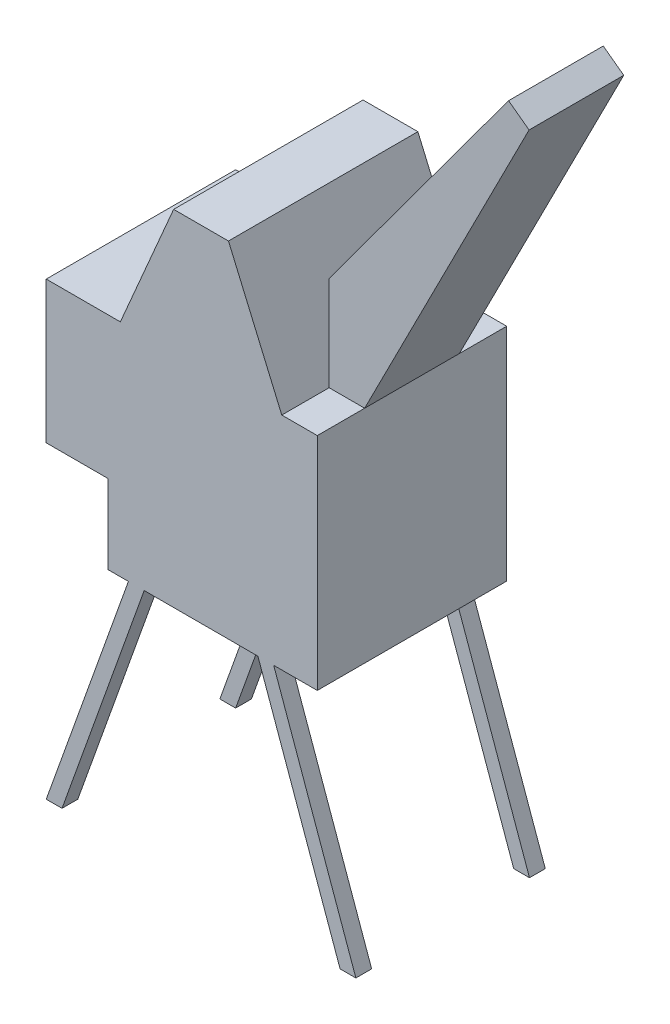
ISO-10303-21;
HEADER;
FILE_DESCRIPTION(('STEP AP214'),'2;1');
FILE_NAME('part.step','',(''),(''),'','','');
FILE_SCHEMA(('AUTOMOTIVE_DESIGN { 1 0 10303 214 1 1 1 1 }'));
ENDSEC;
DATA;
#1=APPLICATION_CONTEXT('core data for automotive mechanical design processes');
#2=APPLICATION_PROTOCOL_DEFINITION('international standard','automotive_design',2000,#1);
#3=PRODUCT_CONTEXT('',#1,'mechanical');
#4=PRODUCT('Part','Part','',(#3));
#5=PRODUCT_RELATED_PRODUCT_CATEGORY('part','',(#4));
#6=PRODUCT_DEFINITION_FORMATION('','',#4);
#7=PRODUCT_DEFINITION_CONTEXT('part definition',#1,'design');
#8=PRODUCT_DEFINITION('design','',#6,#7);
#9=PRODUCT_DEFINITION_SHAPE('','',#8);
#10=(LENGTH_UNIT() NAMED_UNIT(*) SI_UNIT(.MILLI.,.METRE.));
#11=(NAMED_UNIT(*) PLANE_ANGLE_UNIT() SI_UNIT($,.RADIAN.));
#12=(NAMED_UNIT(*) SI_UNIT($,.STERADIAN.) SOLID_ANGLE_UNIT());
#13=UNCERTAINTY_MEASURE_WITH_UNIT(LENGTH_MEASURE(1.E-05),#10,'distance_accuracy_value','');
#14=(GEOMETRIC_REPRESENTATION_CONTEXT(3) GLOBAL_UNCERTAINTY_ASSIGNED_CONTEXT((#13)) GLOBAL_UNIT_ASSIGNED_CONTEXT((#10,
#11,#12)) REPRESENTATION_CONTEXT('',''));
#15=CARTESIAN_POINT('',(0.,0.,0.));
#16=DIRECTION('',(0.,0.,1.));
#17=DIRECTION('',(1.,0.,0.));
#18=AXIS2_PLACEMENT_3D('',#15,#16,#17);
#19=CARTESIAN_POINT('',(397.181123675562,1478.72440717202,609.6));
#20=DIRECTION('',(0.,1.,0.));
#21=DIRECTION('',(0.,0.,1.));
#22=AXIS2_PLACEMENT_3D('',#19,#20,#21);
#23=PLANE('',#22);
#24=DIRECTION('',(0.,0.,-1.));
#25=VECTOR('',#24,1.);
#26=CARTESIAN_POINT('',(1464.20410179023,1478.72440717202,-508.));
#27=LINE('',#26,#25);
#28=CARTESIAN_POINT('',(1464.20410179023,1478.72440717202,-508.));
#29=VERTEX_POINT('',#28);
#30=CARTESIAN_POINT('',(1464.20410179023,1478.72440717202,-609.6));
#31=VERTEX_POINT('',#30);
#32=EDGE_CURVE('E260',#29,#31,#27,.T.);
#33=ORIENTED_EDGE('',*,*,#32,.T.);
#34=DIRECTION('',(1.,0.,0.));
#35=VECTOR('',#34,1.);
#36=CARTESIAN_POINT('',(397.181123675562,1478.72440717202,-609.6));
#37=LINE('',#36,#35);
#38=CARTESIAN_POINT('',(1744.83154288961,1478.72440717202,-609.6));
#39=VERTEX_POINT('',#38);
#40=EDGE_CURVE('E413',#31,#39,#37,.T.);
#41=ORIENTED_EDGE('',*,*,#40,.T.);
#42=DIRECTION('',(0.,0.,-1.));
#43=VECTOR('',#42,1.);
#44=CARTESIAN_POINT('',(1744.83154288961,1478.72440717202,609.6));
#45=LINE('',#44,#43);
#46=CARTESIAN_POINT('',(1744.83154288961,1478.72440717202,609.6));
#47=VERTEX_POINT('',#46);
#48=EDGE_CURVE('E43',#47,#39,#45,.T.);
#49=ORIENTED_EDGE('',*,*,#48,.F.);
#50=DIRECTION('',(1.,0.,0.));
#51=VECTOR('',#50,1.);
#52=CARTESIAN_POINT('',(397.181123675562,1478.72440717202,609.6));
#53=LINE('',#52,#51);
#54=CARTESIAN_POINT('',(1464.20410179023,1478.72440717202,609.6));
#55=VERTEX_POINT('',#54);
#56=EDGE_CURVE('E37',#55,#47,#53,.T.);
#57=ORIENTED_EDGE('',*,*,#56,.F.);
#58=DIRECTION('',(0.,0.,1.));
#59=VECTOR('',#58,1.);
#60=CARTESIAN_POINT('',(1464.20410179023,1478.72440717202,508.));
#61=LINE('',#60,#59);
#62=CARTESIAN_POINT('',(1464.20410179023,1478.72440717202,508.));
#63=VERTEX_POINT('',#62);
#64=EDGE_CURVE('E316',#63,#55,#61,.T.);
#65=ORIENTED_EDGE('',*,*,#64,.F.);
#66=DIRECTION('',(-1.,0.,0.));
#67=VECTOR('',#66,1.);
#68=CARTESIAN_POINT('',(1464.20410179023,1478.72440717202,508.));
#69=LINE('',#68,#67);
#70=CARTESIAN_POINT('',(1362.60410179023,1478.72440717202,508.));
#71=VERTEX_POINT('',#70);
#72=EDGE_CURVE('E306',#63,#71,#69,.T.);
#73=ORIENTED_EDGE('',*,*,#72,.T.);
#74=DIRECTION('',(0.,0.,1.));
#75=VECTOR('',#74,1.);
#76=CARTESIAN_POINT('',(1362.60410179023,1478.72440717202,508.));
#77=LINE('',#76,#75);
#78=CARTESIAN_POINT('',(1362.60410179023,1478.72440717202,609.6));
#79=VERTEX_POINT('',#78);
#80=EDGE_CURVE('E328',#71,#79,#77,.T.);
#81=ORIENTED_EDGE('',*,*,#80,.T.);
#82=CARTESIAN_POINT('',(630.610881251015,1478.72440717202,609.6));
#83=VERTEX_POINT('',#82);
#84=EDGE_CURVE('E377',#83,#79,#53,.T.);
#85=ORIENTED_EDGE('',*,*,#84,.F.);
#86=DIRECTION('',(0.,0.,1.));
#87=VECTOR('',#86,1.);
#88=CARTESIAN_POINT('',(630.610881251015,1478.72440717202,508.));
#89=LINE('',#88,#87);
#90=CARTESIAN_POINT('',(630.610881251015,1478.72440717202,508.));
#91=VERTEX_POINT('',#90);
#92=EDGE_CURVE('E352',#91,#83,#89,.T.);
#93=ORIENTED_EDGE('',*,*,#92,.F.);
#94=DIRECTION('',(-1.,0.,0.));
#95=VECTOR('',#94,1.);
#96=CARTESIAN_POINT('',(630.610881251015,1478.72440717202,508.));
#97=LINE('',#96,#95);
#98=CARTESIAN_POINT('',(529.010881251015,1478.72440717202,508.));
#99=VERTEX_POINT('',#98);
#100=EDGE_CURVE('E333',#91,#99,#97,.T.);
#101=ORIENTED_EDGE('',*,*,#100,.T.);
#102=DIRECTION('',(0.,0.,1.));
#103=VECTOR('',#102,1.);
#104=CARTESIAN_POINT('',(529.010881251015,1478.72440717202,508.));
#105=LINE('',#104,#103);
#106=CARTESIAN_POINT('',(529.010881251015,1478.72440717202,609.6));
#107=VERTEX_POINT('',#106);
#108=EDGE_CURVE('E346',#99,#107,#105,.T.);
#109=ORIENTED_EDGE('',*,*,#108,.T.);
#110=CARTESIAN_POINT('',(397.181123675562,1478.72440717202,609.6));
#111=VERTEX_POINT('',#110);
#112=EDGE_CURVE('E382',#111,#107,#53,.T.);
#113=ORIENTED_EDGE('',*,*,#112,.F.);
#114=DIRECTION('',(0.,0.,-1.));
#115=VECTOR('',#114,1.);
#116=CARTESIAN_POINT('',(397.181123675562,1478.72440717202,609.6));
#117=LINE('',#116,#115);
#118=CARTESIAN_POINT('',(397.181123675562,1478.72440717202,-609.6));
#119=VERTEX_POINT('',#118);
#120=EDGE_CURVE('E11',#111,#119,#117,.T.);
#121=ORIENTED_EDGE('',*,*,#120,.T.);
#122=CARTESIAN_POINT('',(529.010881251015,1478.72440717202,-609.6));
#123=VERTEX_POINT('',#122);
#124=EDGE_CURVE('E415',#119,#123,#37,.T.);
#125=ORIENTED_EDGE('',*,*,#124,.T.);
#126=DIRECTION('',(0.,0.,-1.));
#127=VECTOR('',#126,1.);
#128=CARTESIAN_POINT('',(529.010881251015,1478.72440717202,-508.));
#129=LINE('',#128,#127);
#130=CARTESIAN_POINT('',(529.010881251015,1478.72440717202,-508.));
#131=VERTEX_POINT('',#130);
#132=EDGE_CURVE('E291',#131,#123,#129,.T.);
#133=ORIENTED_EDGE('',*,*,#132,.F.);
#134=DIRECTION('',(-1.,0.,0.));
#135=VECTOR('',#134,1.);
#136=CARTESIAN_POINT('',(630.610881251015,1478.72440717202,-508.));
#137=LINE('',#136,#135);
#138=CARTESIAN_POINT('',(630.610881251015,1478.72440717202,-508.));
#139=VERTEX_POINT('',#138);
#140=EDGE_CURVE('E274',#139,#131,#137,.T.);
#141=ORIENTED_EDGE('',*,*,#140,.F.);
#142=DIRECTION('',(0.,0.,-1.));
#143=VECTOR('',#142,1.);
#144=CARTESIAN_POINT('',(630.610881251015,1478.72440717202,-508.));
#145=LINE('',#144,#143);
#146=CARTESIAN_POINT('',(630.610881251015,1478.72440717202,-609.6));
#147=VERTEX_POINT('',#146);
#148=EDGE_CURVE('E285',#139,#147,#145,.T.);
#149=ORIENTED_EDGE('',*,*,#148,.T.);
#150=CARTESIAN_POINT('',(1362.60410179023,1478.72440717202,-609.6));
#151=VERTEX_POINT('',#150);
#152=EDGE_CURVE('E418',#147,#151,#37,.T.);
#153=ORIENTED_EDGE('',*,*,#152,.T.);
#154=DIRECTION('',(0.,0.,-1.));
#155=VECTOR('',#154,1.);
#156=CARTESIAN_POINT('',(1362.60410179023,1478.72440717202,-508.));
#157=LINE('',#156,#155);
#158=CARTESIAN_POINT('',(1362.60410179023,1478.72440717202,-508.));
#159=VERTEX_POINT('',#158);
#160=EDGE_CURVE('E51',#159,#151,#157,.T.);
#161=ORIENTED_EDGE('',*,*,#160,.F.);
#162=DIRECTION('',(-1.,0.,0.));
#163=VECTOR('',#162,1.);
#164=CARTESIAN_POINT('',(1464.20410179023,1478.72440717202,-508.));
#165=LINE('',#164,#163);
#166=EDGE_CURVE('E55',#29,#159,#165,.T.);
#167=ORIENTED_EDGE('',*,*,#166,.F.);
#168=EDGE_LOOP('',(#33,#41,#49,#57,#65,#73,#81,#85,#93,#101,#109,#113,#121,#125,#133,#141,#149,
#153,#161,#167));
#169=FACE_BOUND('',#168,.T.);
#170=ADVANCED_FACE('F33',(#169),#23,.F.);
#171=CARTESIAN_POINT('',(1516.23154288961,2899.73266424527,609.6));
#172=DIRECTION('',(0.,-1.,0.));
#173=DIRECTION('',(0.,0.,-1.));
#174=AXIS2_PLACEMENT_3D('',#171,#172,#173);
#175=PLANE('',#174);
#176=DIRECTION('',(1.,0.,0.));
#177=VECTOR('',#176,1.);
#178=CARTESIAN_POINT('',(1516.23154288961,2899.73266424527,304.8));
#179=LINE('',#178,#177);
#180=CARTESIAN_POINT('',(1516.23154288961,2899.73266424527,304.8));
#181=VERTEX_POINT('',#180);
#182=CARTESIAN_POINT('',(1744.83154288961,2899.73266424527,304.8));
#183=VERTEX_POINT('',#182);
#184=EDGE_CURVE('E495',#181,#183,#179,.T.);
#185=ORIENTED_EDGE('',*,*,#184,.F.);
#186=DIRECTION('',(0.,0.,-1.));
#187=VECTOR('',#186,1.);
#188=CARTESIAN_POINT('',(1516.23154288961,2899.73266424527,609.6));
#189=LINE('',#188,#187);
#190=CARTESIAN_POINT('',(1516.23154288961,2899.73266424527,609.6));
#191=VERTEX_POINT('',#190);
#192=EDGE_CURVE('E454',#191,#181,#189,.T.);
#193=ORIENTED_EDGE('',*,*,#192,.F.);
#194=DIRECTION('',(-1.,0.,0.));
#195=VECTOR('',#194,1.);
#196=CARTESIAN_POINT('',(1516.23154288961,2899.73266424527,609.6));
#197=LINE('',#196,#195);
#198=CARTESIAN_POINT('',(1744.83154288961,2899.73266424527,609.6));
#199=VERTEX_POINT('',#198);
#200=EDGE_CURVE('E395',#199,#191,#197,.T.);
#201=ORIENTED_EDGE('',*,*,#200,.F.);
#202=DIRECTION('',(0.,0.,-1.));
#203=VECTOR('',#202,1.);
#204=CARTESIAN_POINT('',(1744.83154288961,2899.73266424527,609.6));
#205=LINE('',#204,#203);
#206=EDGE_CURVE('E458',#199,#183,#205,.T.);
#207=ORIENTED_EDGE('',*,*,#206,.T.);
#208=EDGE_LOOP('',(#185,#193,#201,#207));
#209=FACE_BOUND('',#208,.T.);
#210=ADVANCED_FACE('F493',(#209),#175,.F.);
#211=CARTESIAN_POINT('',(397.181123675562,1986.75694769304,609.6));
#212=DIRECTION('',(1.,0.,0.));
#213=DIRECTION('',(0.,0.,-1.));
#214=AXIS2_PLACEMENT_3D('',#211,#212,#213);
#215=PLANE('',#214);
#216=DIRECTION('',(0.,-1.,0.));
#217=VECTOR('',#216,1.);
#218=CARTESIAN_POINT('',(397.181123675562,1986.75694769304,-609.6));
#219=LINE('',#218,#217);
#220=CARTESIAN_POINT('',(397.181123675562,1986.75694769304,-609.6));
#221=VERTEX_POINT('',#220);
#222=EDGE_CURVE('E410',#221,#119,#219,.T.);
#223=ORIENTED_EDGE('',*,*,#222,.T.);
#224=ORIENTED_EDGE('',*,*,#120,.F.);
#225=DIRECTION('',(0.,-1.,0.));
#226=VECTOR('',#225,1.);
#227=CARTESIAN_POINT('',(397.181123675562,1986.75694769304,609.6));
#228=LINE('',#227,#226);
#229=CARTESIAN_POINT('',(397.181123675562,1986.75694769304,609.6));
#230=VERTEX_POINT('',#229);
#231=EDGE_CURVE('E387',#230,#111,#228,.T.);
#232=ORIENTED_EDGE('',*,*,#231,.F.);
#233=DIRECTION('',(0.,0.,-1.));
#234=VECTOR('',#233,1.);
#235=CARTESIAN_POINT('',(397.181123675562,1986.75694769304,609.6));
#236=LINE('',#235,#234);
#237=EDGE_CURVE('E409',#230,#221,#236,.T.);
#238=ORIENTED_EDGE('',*,*,#237,.T.);
#239=EDGE_LOOP('',(#223,#224,#232,#238));
#240=FACE_BOUND('',#239,.T.);
#241=ADVANCED_FACE('F35',(#240),#215,.F.);
#242=CARTESIAN_POINT('',(1744.83154288961,2899.73266424527,609.6));
#243=DIRECTION('',(-1.,0.,0.));
#244=DIRECTION('',(0.,-1.,0.));
#245=AXIS2_PLACEMENT_3D('',#242,#243,#244);
#246=PLANE('',#245);
#247=DIRECTION('',(0.,1.,0.));
#248=VECTOR('',#247,1.);
#249=CARTESIAN_POINT('',(1744.83154288961,2899.73266424527,-609.6));
#250=LINE('',#249,#248);
#251=CARTESIAN_POINT('',(1744.83154288961,2899.73266424527,-609.6));
#252=VERTEX_POINT('',#251);
#253=EDGE_CURVE('E417',#39,#252,#250,.T.);
#254=ORIENTED_EDGE('',*,*,#253,.T.);
#255=CARTESIAN_POINT('',(1744.83154288961,2899.73266424527,-304.8));
#256=VERTEX_POINT('',#255);
#257=EDGE_CURVE('E457',#256,#252,#205,.T.);
#258=ORIENTED_EDGE('',*,*,#257,.F.);
#259=DIRECTION('',(0.,0.,-1.));
#260=VECTOR('',#259,1.);
#261=CARTESIAN_POINT('',(1744.83154288961,2899.73266424527,304.8));
#262=LINE('',#261,#260);
#263=EDGE_CURVE('E483',#183,#256,#262,.T.);
#264=ORIENTED_EDGE('',*,*,#263,.F.);
#265=ORIENTED_EDGE('',*,*,#206,.F.);
#266=DIRECTION('',(0.,1.,0.));
#267=VECTOR('',#266,1.);
#268=CARTESIAN_POINT('',(1744.83154288961,2899.73266424527,609.6));
#269=LINE('',#268,#267);
#270=EDGE_CURVE('E385',#47,#199,#269,.T.);
#271=ORIENTED_EDGE('',*,*,#270,.F.);
#272=ORIENTED_EDGE('',*,*,#48,.T.);
#273=EDGE_LOOP('',(#254,#258,#264,#265,#271,#272));
#274=FACE_BOUND('',#273,.T.);
#275=ADVANCED_FACE('F466',(#274),#246,.F.);
#276=CARTESIAN_POINT('',(1516.23154288961,2899.73266424527,-304.8));
#277=VERTEX_POINT('',#276);
#278=CARTESIAN_POINT('',(1516.23154288961,2899.73266424527,-609.6));
#279=VERTEX_POINT('',#278);
#280=EDGE_CURVE('E453',#277,#279,#189,.T.);
#281=ORIENTED_EDGE('',*,*,#280,.F.);
#282=DIRECTION('',(1.,0.,0.));
#283=VECTOR('',#282,1.);
#284=CARTESIAN_POINT('',(1516.23154288961,2899.73266424527,-304.8));
#285=LINE('',#284,#283);
#286=EDGE_CURVE('E481',#277,#256,#285,.T.);
#287=ORIENTED_EDGE('',*,*,#286,.T.);
#288=ORIENTED_EDGE('',*,*,#257,.T.);
#289=DIRECTION('',(-1.,0.,0.));
#290=VECTOR('',#289,1.);
#291=CARTESIAN_POINT('',(1516.23154288961,2899.73266424527,-609.6));
#292=LINE('',#291,#290);
#293=EDGE_CURVE('E421',#252,#279,#292,.T.);
#294=ORIENTED_EDGE('',*,*,#293,.T.);
#295=EDGE_LOOP('',(#281,#287,#288,#294));
#296=FACE_BOUND('',#295,.T.);
#297=ADVANCED_FACE('F478',(#296),#175,.F.);
#298=CARTESIAN_POINT('',(1173.05310330733,3698.52009892287,609.6));
#299=DIRECTION('',(-0.918794433226703,-0.394736354383051,0.));
#300=DIRECTION('',(0.394736354383051,-0.918794433226703,0.));
#301=AXIS2_PLACEMENT_3D('',#298,#299,#300);
#302=PLANE('',#301);
#303=DIRECTION('',(-0.394736354383051,0.918794433226703,0.));
#304=VECTOR('',#303,1.);
#305=CARTESIAN_POINT('',(1173.05310330733,3698.52009892287,-609.6));
#306=LINE('',#305,#304);
#307=CARTESIAN_POINT('',(1173.05310330733,3698.52009892287,-609.6));
#308=VERTEX_POINT('',#307);
#309=EDGE_CURVE('E424',#279,#308,#306,.T.);
#310=ORIENTED_EDGE('',*,*,#309,.T.);
#311=DIRECTION('',(0.,0.,-1.));
#312=VECTOR('',#311,1.);
#313=CARTESIAN_POINT('',(1173.05310330733,3698.52009892287,609.6));
#314=LINE('',#313,#312);
#315=CARTESIAN_POINT('',(1173.05310330733,3698.52009892287,609.6));
#316=VERTEX_POINT('',#315);
#317=EDGE_CURVE('E450',#316,#308,#314,.T.);
#318=ORIENTED_EDGE('',*,*,#317,.F.);
#319=DIRECTION('',(-0.394736354383051,0.918794433226703,0.));
#320=VECTOR('',#319,1.);
#321=CARTESIAN_POINT('',(1173.05310330733,3698.52009892287,609.6));
#322=LINE('',#321,#320);
#323=EDGE_CURVE('E397',#191,#316,#322,.T.);
#324=ORIENTED_EDGE('',*,*,#323,.F.);
#325=ORIENTED_EDGE('',*,*,#192,.T.);
#326=DIRECTION('',(0.,0.,-1.));
#327=VECTOR('',#326,1.);
#328=CARTESIAN_POINT('',(1516.23154288961,2899.73266424527,304.8));
#329=LINE('',#328,#327);
#330=EDGE_CURVE('E488',#181,#277,#329,.T.);
#331=ORIENTED_EDGE('',*,*,#330,.T.);
#332=ORIENTED_EDGE('',*,*,#280,.T.);
#333=EDGE_LOOP('',(#310,#318,#324,#325,#331,#332));
#334=FACE_BOUND('',#333,.T.);
#335=ADVANCED_FACE('F531',(#334),#302,.F.);
#336=CARTESIAN_POINT('',(820.161879733915,3698.52009892287,609.6));
#337=DIRECTION('',(0.,-1.,0.));
#338=DIRECTION('',(0.,0.,-1.));
#339=AXIS2_PLACEMENT_3D('',#336,#337,#338);
#340=PLANE('',#339);
#341=DIRECTION('',(-1.,0.,0.));
#342=VECTOR('',#341,1.);
#343=CARTESIAN_POINT('',(820.161879733915,3698.52009892287,-609.6));
#344=LINE('',#343,#342);
#345=CARTESIAN_POINT('',(820.161879733915,3698.52009892287,-609.6));
#346=VERTEX_POINT('',#345);
#347=EDGE_CURVE('E426',#308,#346,#344,.T.);
#348=ORIENTED_EDGE('',*,*,#347,.T.);
#349=DIRECTION('',(0.,0.,-1.));
#350=VECTOR('',#349,1.);
#351=CARTESIAN_POINT('',(820.161879733915,3698.52009892287,609.6));
#352=LINE('',#351,#350);
#353=CARTESIAN_POINT('',(820.161879733915,3698.52009892287,609.6));
#354=VERTEX_POINT('',#353);
#355=EDGE_CURVE('E447',#354,#346,#352,.T.);
#356=ORIENTED_EDGE('',*,*,#355,.F.);
#357=DIRECTION('',(-1.,0.,0.));
#358=VECTOR('',#357,1.);
#359=CARTESIAN_POINT('',(820.161879733915,3698.52009892287,609.6));
#360=LINE('',#359,#358);
#361=EDGE_CURVE('E399',#316,#354,#360,.T.);
#362=ORIENTED_EDGE('',*,*,#361,.F.);
#363=ORIENTED_EDGE('',*,*,#317,.T.);
#364=EDGE_LOOP('',(#348,#356,#362,#363));
#365=FACE_BOUND('',#364,.T.);
#366=ADVANCED_FACE('F534',(#365),#340,.F.);
#367=CARTESIAN_POINT('',(476.983440151632,2899.73266424527,609.6));
#368=DIRECTION('',(0.918794433226703,-0.394736354383051,0.));
#369=DIRECTION('',(0.394736354383051,0.918794433226703,0.));
#370=AXIS2_PLACEMENT_3D('',#367,#368,#369);
#371=PLANE('',#370);
#372=DIRECTION('',(-0.394736354383051,-0.918794433226703,0.));
#373=VECTOR('',#372,1.);
#374=CARTESIAN_POINT('',(476.983440151632,2899.73266424527,-609.6));
#375=LINE('',#374,#373);
#376=CARTESIAN_POINT('',(476.983440151632,2899.73266424527,-609.6));
#377=VERTEX_POINT('',#376);
#378=EDGE_CURVE('E428',#346,#377,#375,.T.);
#379=ORIENTED_EDGE('',*,*,#378,.T.);
#380=DIRECTION('',(0.,0.,-1.));
#381=VECTOR('',#380,1.);
#382=CARTESIAN_POINT('',(476.983440151632,2899.73266424527,609.6));
#383=LINE('',#382,#381);
#384=CARTESIAN_POINT('',(476.983440151632,2899.73266424527,609.6));
#385=VERTEX_POINT('',#384);
#386=EDGE_CURVE('E444',#385,#377,#383,.T.);
#387=ORIENTED_EDGE('',*,*,#386,.F.);
#388=DIRECTION('',(-0.394736354383051,-0.918794433226703,0.));
#389=VECTOR('',#388,1.);
#390=CARTESIAN_POINT('',(476.983440151632,2899.73266424527,609.6));
#391=LINE('',#390,#389);
#392=EDGE_CURVE('E401',#354,#385,#391,.T.);
#393=ORIENTED_EDGE('',*,*,#392,.F.);
#394=ORIENTED_EDGE('',*,*,#355,.T.);
#395=EDGE_LOOP('',(#379,#387,#393,#394));
#396=FACE_BOUND('',#395,.T.);
#397=ADVANCED_FACE('F538',(#396),#371,.F.);
#398=CARTESIAN_POINT('',(0.,2899.73266424527,609.6));
#399=DIRECTION('',(0.,-1.,0.));
#400=DIRECTION('',(0.,0.,-1.));
#401=AXIS2_PLACEMENT_3D('',#398,#399,#400);
#402=PLANE('',#401);
#403=DIRECTION('',(-1.,0.,0.));
#404=VECTOR('',#403,1.);
#405=CARTESIAN_POINT('',(0.,2899.73266424527,-609.6));
#406=LINE('',#405,#404);
#407=CARTESIAN_POINT('',(0.,2899.73266424527,-609.6));
#408=VERTEX_POINT('',#407);
#409=EDGE_CURVE('E430',#377,#408,#406,.T.);
#410=ORIENTED_EDGE('',*,*,#409,.T.);
#411=DIRECTION('',(0.,0.,-1.));
#412=VECTOR('',#411,1.);
#413=CARTESIAN_POINT('',(0.,2899.73266424527,609.6));
#414=LINE('',#413,#412);
#415=CARTESIAN_POINT('',(0.,2899.73266424527,609.6));
#416=VERTEX_POINT('',#415);
#417=EDGE_CURVE('E441',#416,#408,#414,.T.);
#418=ORIENTED_EDGE('',*,*,#417,.F.);
#419=DIRECTION('',(-1.,0.,0.));
#420=VECTOR('',#419,1.);
#421=CARTESIAN_POINT('',(0.,2899.73266424527,609.6));
#422=LINE('',#421,#420);
#423=EDGE_CURVE('E403',#385,#416,#422,.T.);
#424=ORIENTED_EDGE('',*,*,#423,.F.);
#425=ORIENTED_EDGE('',*,*,#386,.T.);
#426=EDGE_LOOP('',(#410,#418,#424,#425));
#427=FACE_BOUND('',#426,.T.);
#428=ADVANCED_FACE('F542',(#427),#402,.F.);
#429=CARTESIAN_POINT('',(0.,1986.75694769304,609.6));
#430=DIRECTION('',(1.,0.,0.));
#431=DIRECTION('',(0.,0.,-1.));
#432=AXIS2_PLACEMENT_3D('',#429,#430,#431);
#433=PLANE('',#432);
#434=DIRECTION('',(0.,-1.,0.));
#435=VECTOR('',#434,1.);
#436=CARTESIAN_POINT('',(0.,1986.75694769304,-609.6));
#437=LINE('',#436,#435);
#438=CARTESIAN_POINT('',(0.,1986.75694769304,-609.6));
#439=VERTEX_POINT('',#438);
#440=EDGE_CURVE('E432',#408,#439,#437,.T.);
#441=ORIENTED_EDGE('',*,*,#440,.T.);
#442=DIRECTION('',(0.,0.,-1.));
#443=VECTOR('',#442,1.);
#444=CARTESIAN_POINT('',(0.,1986.75694769304,609.6));
#445=LINE('',#444,#443);
#446=CARTESIAN_POINT('',(0.,1986.75694769304,609.6));
#447=VERTEX_POINT('',#446);
#448=EDGE_CURVE('E438',#447,#439,#445,.T.);
#449=ORIENTED_EDGE('',*,*,#448,.F.);
#450=DIRECTION('',(0.,-1.,0.));
#451=VECTOR('',#450,1.);
#452=CARTESIAN_POINT('',(0.,1986.75694769304,609.6));
#453=LINE('',#452,#451);
#454=EDGE_CURVE('E405',#416,#447,#453,.T.);
#455=ORIENTED_EDGE('',*,*,#454,.F.);
#456=ORIENTED_EDGE('',*,*,#417,.T.);
#457=EDGE_LOOP('',(#441,#449,#455,#456));
#458=FACE_BOUND('',#457,.T.);
#459=ADVANCED_FACE('F546',(#458),#433,.F.);
#460=CARTESIAN_POINT('',(0.,1986.75694769304,609.6));
#461=DIRECTION('',(0.,1.,0.));
#462=DIRECTION('',(-1.,0.,0.));
#463=AXIS2_PLACEMENT_3D('',#460,#461,#462);
#464=PLANE('',#463);
#465=DIRECTION('',(1.,0.,0.));
#466=VECTOR('',#465,1.);
#467=CARTESIAN_POINT('',(0.,1986.75694769304,-609.6));
#468=LINE('',#467,#466);
#469=EDGE_CURVE('E434',#439,#221,#468,.T.);
#470=ORIENTED_EDGE('',*,*,#469,.T.);
#471=ORIENTED_EDGE('',*,*,#237,.F.);
#472=DIRECTION('',(1.,0.,0.));
#473=VECTOR('',#472,1.);
#474=CARTESIAN_POINT('',(0.,1986.75694769304,609.6));
#475=LINE('',#474,#473);
#476=EDGE_CURVE('E407',#447,#230,#475,.T.);
#477=ORIENTED_EDGE('',*,*,#476,.F.);
#478=ORIENTED_EDGE('',*,*,#448,.T.);
#479=EDGE_LOOP('',(#470,#471,#477,#478));
#480=FACE_BOUND('',#479,.T.);
#481=ADVANCED_FACE('F550',(#480),#464,.F.);
#482=CARTESIAN_POINT('',(0.,0.,609.6));
#483=DIRECTION('',(0.,0.,1.));
#484=DIRECTION('',(1.,0.,0.));
#485=AXIS2_PLACEMENT_3D('',#482,#483,#484);
#486=PLANE('',#485);
#487=ORIENTED_EDGE('',*,*,#231,.T.);
#488=ORIENTED_EDGE('',*,*,#112,.T.);
#489=DIRECTION('',(-0.336841775783628,-0.941561266241837,0.));
#490=VECTOR('',#489,1.);
#491=CARTESIAN_POINT('',(529.010881251015,1478.72440717202,609.6));
#492=LINE('',#491,#490);
#493=CARTESIAN_POINT('',(0.,0.,609.6));
#494=VERTEX_POINT('',#493);
#495=EDGE_CURVE('E325',#107,#494,#492,.T.);
#496=ORIENTED_EDGE('',*,*,#495,.T.);
#497=DIRECTION('',(1.,0.,0.));
#498=VECTOR('',#497,1.);
#499=CARTESIAN_POINT('',(0.,0.,609.6));
#500=LINE('',#499,#498);
#501=CARTESIAN_POINT('',(101.6,0.,609.6));
#502=VERTEX_POINT('',#501);
#503=EDGE_CURVE('E347',#494,#502,#500,.T.);
#504=ORIENTED_EDGE('',*,*,#503,.T.);
#505=DIRECTION('',(0.336841775783628,0.941561266241837,0.));
#506=VECTOR('',#505,1.);
#507=CARTESIAN_POINT('',(101.6,0.,609.6));
#508=LINE('',#507,#506);
#509=EDGE_CURVE('E337',#502,#83,#508,.T.);
#510=ORIENTED_EDGE('',*,*,#509,.T.);
#511=ORIENTED_EDGE('',*,*,#84,.T.);
#512=DIRECTION('',(0.336841775783629,-0.941561266241837,0.));
#513=VECTOR('',#512,1.);
#514=CARTESIAN_POINT('',(1362.60410179023,1478.72440717202,609.6));
#515=LINE('',#514,#513);
#516=CARTESIAN_POINT('',(1891.61498304125,0.,609.6));
#517=VERTEX_POINT('',#516);
#518=EDGE_CURVE('E318',#79,#517,#515,.T.);
#519=ORIENTED_EDGE('',*,*,#518,.T.);
#520=DIRECTION('',(1.,0.,0.));
#521=VECTOR('',#520,1.);
#522=CARTESIAN_POINT('',(1891.61498304125,0.,609.6));
#523=LINE('',#522,#521);
#524=CARTESIAN_POINT('',(1993.21498304125,0.,609.6));
#525=VERTEX_POINT('',#524);
#526=EDGE_CURVE('E307',#517,#525,#523,.T.);
#527=ORIENTED_EDGE('',*,*,#526,.T.);
#528=DIRECTION('',(-0.336841775783628,0.941561266241837,0.));
#529=VECTOR('',#528,1.);
#530=CARTESIAN_POINT('',(1993.21498304125,0.,609.6));
#531=LINE('',#530,#529);
#532=EDGE_CURVE('E294',#525,#55,#531,.T.);
#533=ORIENTED_EDGE('',*,*,#532,.T.);
#534=ORIENTED_EDGE('',*,*,#56,.T.);
#535=ORIENTED_EDGE('',*,*,#270,.T.);
#536=ORIENTED_EDGE('',*,*,#200,.T.);
#537=ORIENTED_EDGE('',*,*,#323,.T.);
#538=ORIENTED_EDGE('',*,*,#361,.T.);
#539=ORIENTED_EDGE('',*,*,#392,.T.);
#540=ORIENTED_EDGE('',*,*,#423,.T.);
#541=ORIENTED_EDGE('',*,*,#454,.T.);
#542=ORIENTED_EDGE('',*,*,#476,.T.);
#543=EDGE_LOOP('',(#487,#488,#496,#504,#510,#511,#519,#527,#533,#534,#535,#536,#537,#538,#539,
#540,#541,#542));
#544=FACE_BOUND('',#543,.T.);
#545=ADVANCED_FACE('F376',(#544),#486,.T.);
#546=CARTESIAN_POINT('',(0.,0.,-609.6));
#547=DIRECTION('',(0.,0.,1.));
#548=DIRECTION('',(1.,0.,0.));
#549=AXIS2_PLACEMENT_3D('',#546,#547,#548);
#550=PLANE('',#549);
#551=ORIENTED_EDGE('',*,*,#222,.F.);
#552=ORIENTED_EDGE('',*,*,#469,.F.);
#553=ORIENTED_EDGE('',*,*,#440,.F.);
#554=ORIENTED_EDGE('',*,*,#409,.F.);
#555=ORIENTED_EDGE('',*,*,#378,.F.);
#556=ORIENTED_EDGE('',*,*,#347,.F.);
#557=ORIENTED_EDGE('',*,*,#309,.F.);
#558=ORIENTED_EDGE('',*,*,#293,.F.);
#559=ORIENTED_EDGE('',*,*,#253,.F.);
#560=ORIENTED_EDGE('',*,*,#40,.F.);
#561=DIRECTION('',(-0.336841775783628,0.941561266241837,0.));
#562=VECTOR('',#561,1.);
#563=CARTESIAN_POINT('',(1993.21498304125,0.,-609.6));
#564=LINE('',#563,#562);
#565=CARTESIAN_POINT('',(1993.21498304125,0.,-609.6));
#566=VERTEX_POINT('',#565);
#567=EDGE_CURVE('E267',#566,#31,#564,.T.);
#568=ORIENTED_EDGE('',*,*,#567,.F.);
#569=DIRECTION('',(1.,0.,0.));
#570=VECTOR('',#569,1.);
#571=CARTESIAN_POINT('',(1891.61498304125,0.,-609.6));
#572=LINE('',#571,#570);
#573=CARTESIAN_POINT('',(1891.61498304125,0.,-609.6));
#574=VERTEX_POINT('',#573);
#575=EDGE_CURVE('E253',#574,#566,#572,.T.);
#576=ORIENTED_EDGE('',*,*,#575,.F.);
#577=DIRECTION('',(0.336841775783629,-0.941561266241837,0.));
#578=VECTOR('',#577,1.);
#579=CARTESIAN_POINT('',(1362.60410179023,1478.72440717202,-609.6));
#580=LINE('',#579,#578);
#581=EDGE_CURVE('E261',#151,#574,#580,.T.);
#582=ORIENTED_EDGE('',*,*,#581,.F.);
#583=ORIENTED_EDGE('',*,*,#152,.F.);
#584=DIRECTION('',(0.336841775783628,0.941561266241837,0.));
#585=VECTOR('',#584,1.);
#586=CARTESIAN_POINT('',(101.6,0.,-609.6));
#587=LINE('',#586,#585);
#588=CARTESIAN_POINT('',(101.6,0.,-609.6));
#589=VERTEX_POINT('',#588);
#590=EDGE_CURVE('E271',#589,#147,#587,.T.);
#591=ORIENTED_EDGE('',*,*,#590,.F.);
#592=DIRECTION('',(1.,0.,0.));
#593=VECTOR('',#592,1.);
#594=CARTESIAN_POINT('',(0.,0.,-609.6));
#595=LINE('',#594,#593);
#596=CARTESIAN_POINT('',(0.,0.,-609.6));
#597=VERTEX_POINT('',#596);
#598=EDGE_CURVE('E288',#597,#589,#595,.T.);
#599=ORIENTED_EDGE('',*,*,#598,.F.);
#600=DIRECTION('',(-0.336841775783628,-0.941561266241837,0.));
#601=VECTOR('',#600,1.);
#602=CARTESIAN_POINT('',(529.010881251015,1478.72440717202,-609.6));
#603=LINE('',#602,#601);
#604=EDGE_CURVE('E278',#123,#597,#603,.T.);
#605=ORIENTED_EDGE('',*,*,#604,.F.);
#606=ORIENTED_EDGE('',*,*,#124,.F.);
#607=EDGE_LOOP('',(#551,#552,#553,#554,#555,#556,#557,#558,#559,#560,#568,#576,#582,#583,#591,
#599,#605,#606));
#608=FACE_BOUND('',#607,.T.);
#609=ADVANCED_FACE('F473',(#608),#550,.F.);
#610=CARTESIAN_POINT('',(2671.22713109487,5077.45545682714,304.8));
#611=DIRECTION('',(0.805169430040808,-0.593044845629536,0.));
#612=DIRECTION('',(0.593044845629536,0.805169430040808,0.));
#613=AXIS2_PLACEMENT_3D('',#610,#611,#612);
#614=PLANE('',#613);
#615=DIRECTION('',(-0.593044845629536,-0.805169430040808,0.));
#616=VECTOR('',#615,1.);
#617=CARTESIAN_POINT('',(2671.22713109487,5077.45545682714,-304.8));
#618=LINE('',#617,#616);
#619=CARTESIAN_POINT('',(2671.22713109487,5077.45545682714,-304.8));
#620=VERTEX_POINT('',#619);
#621=CARTESIAN_POINT('',(1516.23154288961,3509.33266424526,-304.8));
#622=VERTEX_POINT('',#621);
#623=EDGE_CURVE('E366',#620,#622,#618,.T.);
#624=ORIENTED_EDGE('',*,*,#623,.T.);
#625=DIRECTION('',(0.,0.,-1.));
#626=VECTOR('',#625,1.);
#627=CARTESIAN_POINT('',(1516.23154288961,3509.33266424526,304.8));
#628=LINE('',#627,#626);
#629=CARTESIAN_POINT('',(1516.23154288961,3509.33266424526,304.8));
#630=VERTEX_POINT('',#629);
#631=EDGE_CURVE('E414',#630,#622,#628,.T.);
#632=ORIENTED_EDGE('',*,*,#631,.F.);
#633=DIRECTION('',(-0.593044845629536,-0.805169430040808,0.));
#634=VECTOR('',#633,1.);
#635=CARTESIAN_POINT('',(2671.22713109487,5077.45545682714,304.8));
#636=LINE('',#635,#634);
#637=CARTESIAN_POINT('',(2671.22713109487,5077.45545682714,304.8));
#638=VERTEX_POINT('',#637);
#639=EDGE_CURVE('E357',#638,#630,#636,.T.);
#640=ORIENTED_EDGE('',*,*,#639,.F.);
#641=DIRECTION('',(0.,0.,-1.));
#642=VECTOR('',#641,1.);
#643=CARTESIAN_POINT('',(2671.22713109487,5077.45545682714,304.8));
#644=LINE('',#643,#642);
#645=EDGE_CURVE('E737',#638,#620,#644,.T.);
#646=ORIENTED_EDGE('',*,*,#645,.T.);
#647=EDGE_LOOP('',(#624,#632,#640,#646));
#648=FACE_BOUND('',#647,.T.);
#649=ADVANCED_FACE('F557',(#648),#614,.F.);
#650=CARTESIAN_POINT('',(1516.23154288961,3509.33266424526,304.8));
#651=DIRECTION('',(1.,0.,0.));
#652=DIRECTION('',(0.,0.,-1.));
#653=AXIS2_PLACEMENT_3D('',#650,#651,#652);
#654=PLANE('',#653);
#655=DIRECTION('',(0.,-1.,0.));
#656=VECTOR('',#655,1.);
#657=CARTESIAN_POINT('',(1516.23154288961,3509.33266424526,-304.8));
#658=LINE('',#657,#656);
#659=EDGE_CURVE('E746',#622,#277,#658,.T.);
#660=ORIENTED_EDGE('',*,*,#659,.T.);
#661=ORIENTED_EDGE('',*,*,#330,.F.);
#662=DIRECTION('',(0.,-1.,0.));
#663=VECTOR('',#662,1.);
#664=CARTESIAN_POINT('',(1516.23154288961,3509.33266424526,304.8));
#665=LINE('',#664,#663);
#666=EDGE_CURVE('E753',#630,#181,#665,.T.);
#667=ORIENTED_EDGE('',*,*,#666,.F.);
#668=ORIENTED_EDGE('',*,*,#631,.T.);
#669=EDGE_LOOP('',(#660,#661,#667,#668));
#670=FACE_BOUND('',#669,.T.);
#671=ADVANCED_FACE('F562',(#670),#654,.F.);
#672=CARTESIAN_POINT('',(1744.83154288961,2899.73266424527,304.8));
#673=DIRECTION('',(-0.891293626386008,0.453426588946523,0.));
#674=DIRECTION('',(-0.453426588946523,-0.891293626386008,0.));
#675=AXIS2_PLACEMENT_3D('',#672,#673,#674);
#676=PLANE('',#675);
#677=DIRECTION('',(0.453426588946523,0.891293626386008,0.));
#678=VECTOR('',#677,1.);
#679=CARTESIAN_POINT('',(1744.83154288961,2899.73266424527,-304.8));
#680=LINE('',#679,#678);
#681=CARTESIAN_POINT('',(2803.23705334484,4980.22399095003,-304.8));
#682=VERTEX_POINT('',#681);
#683=EDGE_CURVE('E743',#256,#682,#680,.T.);
#684=ORIENTED_EDGE('',*,*,#683,.T.);
#685=DIRECTION('',(0.,0.,-1.));
#686=VECTOR('',#685,1.);
#687=CARTESIAN_POINT('',(2803.23705334484,4980.22399095003,304.8));
#688=LINE('',#687,#686);
#689=CARTESIAN_POINT('',(2803.23705334484,4980.22399095003,304.8));
#690=VERTEX_POINT('',#689);
#691=EDGE_CURVE('E489',#690,#682,#688,.T.);
#692=ORIENTED_EDGE('',*,*,#691,.F.);
#693=DIRECTION('',(0.453426588946523,0.891293626386008,0.));
#694=VECTOR('',#693,1.);
#695=CARTESIAN_POINT('',(1744.83154288961,2899.73266424527,304.8));
#696=LINE('',#695,#694);
#697=EDGE_CURVE('E751',#183,#690,#696,.T.);
#698=ORIENTED_EDGE('',*,*,#697,.F.);
#699=ORIENTED_EDGE('',*,*,#263,.T.);
#700=EDGE_LOOP('',(#684,#692,#698,#699));
#701=FACE_BOUND('',#700,.T.);
#702=ADVANCED_FACE('F566',(#701),#676,.F.);
#703=CARTESIAN_POINT('',(2803.23705334484,4980.22399095003,304.8));
#704=DIRECTION('',(-0.593044845629536,-0.805169430040808,0.));
#705=DIRECTION('',(0.805169430040808,-0.593044845629536,0.));
#706=AXIS2_PLACEMENT_3D('',#703,#704,#705);
#707=PLANE('',#706);
#708=DIRECTION('',(-0.805169430040808,0.593044845629536,0.));
#709=VECTOR('',#708,1.);
#710=CARTESIAN_POINT('',(2803.23705334484,4980.22399095003,-304.8));
#711=LINE('',#710,#709);
#712=EDGE_CURVE('E741',#682,#620,#711,.T.);
#713=ORIENTED_EDGE('',*,*,#712,.T.);
#714=ORIENTED_EDGE('',*,*,#645,.F.);
#715=DIRECTION('',(-0.805169430040808,0.593044845629536,0.));
#716=VECTOR('',#715,1.);
#717=CARTESIAN_POINT('',(2803.23705334484,4980.22399095003,304.8));
#718=LINE('',#717,#716);
#719=EDGE_CURVE('E740',#690,#638,#718,.T.);
#720=ORIENTED_EDGE('',*,*,#719,.F.);
#721=ORIENTED_EDGE('',*,*,#691,.T.);
#722=EDGE_LOOP('',(#713,#714,#720,#721));
#723=FACE_BOUND('',#722,.T.);
#724=ADVANCED_FACE('F570',(#723),#707,.F.);
#725=CARTESIAN_POINT('',(0.,0.,304.8));
#726=DIRECTION('',(0.,0.,-1.));
#727=DIRECTION('',(-1.,0.,0.));
#728=AXIS2_PLACEMENT_3D('',#725,#726,#727);
#729=PLANE('',#728);
#730=ORIENTED_EDGE('',*,*,#639,.T.);
#731=ORIENTED_EDGE('',*,*,#666,.T.);
#732=ORIENTED_EDGE('',*,*,#184,.T.);
#733=ORIENTED_EDGE('',*,*,#697,.T.);
#734=ORIENTED_EDGE('',*,*,#719,.T.);
#735=EDGE_LOOP('',(#730,#731,#732,#733,#734));
#736=FACE_BOUND('',#735,.T.);
#737=ADVANCED_FACE('F573',(#736),#729,.F.);
#738=CARTESIAN_POINT('',(0.,0.,-304.8));
#739=DIRECTION('',(0.,0.,-1.));
#740=DIRECTION('',(-1.,0.,0.));
#741=AXIS2_PLACEMENT_3D('',#738,#739,#740);
#742=PLANE('',#741);
#743=ORIENTED_EDGE('',*,*,#623,.F.);
#744=ORIENTED_EDGE('',*,*,#712,.F.);
#745=ORIENTED_EDGE('',*,*,#683,.F.);
#746=ORIENTED_EDGE('',*,*,#286,.F.);
#747=ORIENTED_EDGE('',*,*,#659,.F.);
#748=EDGE_LOOP('',(#743,#744,#745,#746,#747));
#749=FACE_BOUND('',#748,.T.);
#750=ADVANCED_FACE('F575',(#749),#742,.T.);
#751=CARTESIAN_POINT('',(101.6,0.,508.));
#752=DIRECTION('',(0.941561266241837,-0.336841775783628,0.));
#753=DIRECTION('',(0.336841775783628,0.941561266241837,0.));
#754=AXIS2_PLACEMENT_3D('',#751,#752,#753);
#755=PLANE('',#754);
#756=ORIENTED_EDGE('',*,*,#509,.F.);
#757=DIRECTION('',(0.,0.,1.));
#758=VECTOR('',#757,1.);
#759=CARTESIAN_POINT('',(101.6,0.,508.));
#760=LINE('',#759,#758);
#761=CARTESIAN_POINT('',(101.6,0.,508.));
#762=VERTEX_POINT('',#761);
#763=EDGE_CURVE('E350',#762,#502,#760,.T.);
#764=ORIENTED_EDGE('',*,*,#763,.F.);
#765=DIRECTION('',(0.336841775783628,0.941561266241837,0.));
#766=VECTOR('',#765,1.);
#767=CARTESIAN_POINT('',(101.6,0.,508.));
#768=LINE('',#767,#766);
#769=EDGE_CURVE('E343',#762,#91,#768,.T.);
#770=ORIENTED_EDGE('',*,*,#769,.T.);
#771=ORIENTED_EDGE('',*,*,#92,.T.);
#772=EDGE_LOOP('',(#756,#764,#770,#771));
#773=FACE_BOUND('',#772,.T.);
#774=ADVANCED_FACE('F578',(#773),#755,.T.);
#775=CARTESIAN_POINT('',(0.,0.,508.));
#776=DIRECTION('',(0.,-1.,0.));
#777=DIRECTION('',(1.,0.,0.));
#778=AXIS2_PLACEMENT_3D('',#775,#776,#777);
#779=PLANE('',#778);
#780=ORIENTED_EDGE('',*,*,#503,.F.);
#781=DIRECTION('',(0.,0.,1.));
#782=VECTOR('',#781,1.);
#783=CARTESIAN_POINT('',(0.,0.,508.));
#784=LINE('',#783,#782);
#785=CARTESIAN_POINT('',(0.,0.,508.));
#786=VERTEX_POINT('',#785);
#787=EDGE_CURVE('E353',#786,#494,#784,.T.);
#788=ORIENTED_EDGE('',*,*,#787,.F.);
#789=DIRECTION('',(1.,0.,0.));
#790=VECTOR('',#789,1.);
#791=CARTESIAN_POINT('',(0.,0.,508.));
#792=LINE('',#791,#790);
#793=EDGE_CURVE('E340',#786,#762,#792,.T.);
#794=ORIENTED_EDGE('',*,*,#793,.T.);
#795=ORIENTED_EDGE('',*,*,#763,.T.);
#796=EDGE_LOOP('',(#780,#788,#794,#795));
#797=FACE_BOUND('',#796,.T.);
#798=ADVANCED_FACE('F587',(#797),#779,.T.);
#799=CARTESIAN_POINT('',(529.010881251015,1478.72440717202,508.));
#800=DIRECTION('',(-0.941561266241837,0.336841775783628,0.));
#801=DIRECTION('',(-0.336841775783628,-0.941561266241837,0.));
#802=AXIS2_PLACEMENT_3D('',#799,#800,#801);
#803=PLANE('',#802);
#804=ORIENTED_EDGE('',*,*,#495,.F.);
#805=ORIENTED_EDGE('',*,*,#108,.F.);
#806=DIRECTION('',(-0.336841775783628,-0.941561266241837,0.));
#807=VECTOR('',#806,1.);
#808=CARTESIAN_POINT('',(529.010881251015,1478.72440717202,508.));
#809=LINE('',#808,#807);
#810=EDGE_CURVE('E336',#99,#786,#809,.T.);
#811=ORIENTED_EDGE('',*,*,#810,.T.);
#812=ORIENTED_EDGE('',*,*,#787,.T.);
#813=EDGE_LOOP('',(#804,#805,#811,#812));
#814=FACE_BOUND('',#813,.T.);
#815=ADVANCED_FACE('F583',(#814),#803,.T.);
#816=CARTESIAN_POINT('',(0.,0.,508.));
#817=DIRECTION('',(0.,0.,1.));
#818=DIRECTION('',(1.,0.,0.));
#819=AXIS2_PLACEMENT_3D('',#816,#817,#818);
#820=PLANE('',#819);
#821=ORIENTED_EDGE('',*,*,#100,.F.);
#822=ORIENTED_EDGE('',*,*,#769,.F.);
#823=ORIENTED_EDGE('',*,*,#793,.F.);
#824=ORIENTED_EDGE('',*,*,#810,.F.);
#825=EDGE_LOOP('',(#821,#822,#823,#824));
#826=FACE_BOUND('',#825,.T.);
#827=ADVANCED_FACE('F586',(#826),#820,.F.);
#828=CARTESIAN_POINT('',(1993.21498304125,0.,508.));
#829=DIRECTION('',(0.941561266241837,0.336841775783628,0.));
#830=DIRECTION('',(-0.336841775783628,0.941561266241837,0.));
#831=AXIS2_PLACEMENT_3D('',#828,#829,#830);
#832=PLANE('',#831);
#833=ORIENTED_EDGE('',*,*,#532,.F.);
#834=DIRECTION('',(0.,0.,1.));
#835=VECTOR('',#834,1.);
#836=CARTESIAN_POINT('',(1993.21498304125,0.,508.));
#837=LINE('',#836,#835);
#838=CARTESIAN_POINT('',(1993.21498304125,0.,508.));
#839=VERTEX_POINT('',#838);
#840=EDGE_CURVE('E323',#839,#525,#837,.T.);
#841=ORIENTED_EDGE('',*,*,#840,.F.);
#842=DIRECTION('',(-0.336841775783628,0.941561266241837,0.));
#843=VECTOR('',#842,1.);
#844=CARTESIAN_POINT('',(1993.21498304125,0.,508.));
#845=LINE('',#844,#843);
#846=EDGE_CURVE('E303',#839,#63,#845,.T.);
#847=ORIENTED_EDGE('',*,*,#846,.T.);
#848=ORIENTED_EDGE('',*,*,#64,.T.);
#849=EDGE_LOOP('',(#833,#841,#847,#848));
#850=FACE_BOUND('',#849,.T.);
#851=ADVANCED_FACE('F501',(#850),#832,.T.);
#852=CARTESIAN_POINT('',(1891.61498304125,0.,508.));
#853=DIRECTION('',(0.,-1.,0.));
#854=DIRECTION('',(0.,0.,-1.));
#855=AXIS2_PLACEMENT_3D('',#852,#853,#854);
#856=PLANE('',#855);
#857=ORIENTED_EDGE('',*,*,#526,.F.);
#858=DIRECTION('',(0.,0.,1.));
#859=VECTOR('',#858,1.);
#860=CARTESIAN_POINT('',(1891.61498304125,0.,508.));
#861=LINE('',#860,#859);
#862=CARTESIAN_POINT('',(1891.61498304125,0.,508.));
#863=VERTEX_POINT('',#862);
#864=EDGE_CURVE('E326',#863,#517,#861,.T.);
#865=ORIENTED_EDGE('',*,*,#864,.F.);
#866=DIRECTION('',(1.,0.,0.));
#867=VECTOR('',#866,1.);
#868=CARTESIAN_POINT('',(1891.61498304125,0.,508.));
#869=LINE('',#868,#867);
#870=EDGE_CURVE('E313',#863,#839,#869,.T.);
#871=ORIENTED_EDGE('',*,*,#870,.T.);
#872=ORIENTED_EDGE('',*,*,#840,.T.);
#873=EDGE_LOOP('',(#857,#865,#871,#872));
#874=FACE_BOUND('',#873,.T.);
#875=ADVANCED_FACE('F509',(#874),#856,.T.);
#876=CARTESIAN_POINT('',(1362.60410179023,1478.72440717202,508.));
#877=DIRECTION('',(-0.941561266241837,-0.336841775783629,0.));
#878=DIRECTION('',(0.336841775783629,-0.941561266241837,0.));
#879=AXIS2_PLACEMENT_3D('',#876,#877,#878);
#880=PLANE('',#879);
#881=ORIENTED_EDGE('',*,*,#518,.F.);
#882=ORIENTED_EDGE('',*,*,#80,.F.);
#883=DIRECTION('',(0.336841775783629,-0.941561266241837,0.));
#884=VECTOR('',#883,1.);
#885=CARTESIAN_POINT('',(1362.60410179023,1478.72440717202,508.));
#886=LINE('',#885,#884);
#887=EDGE_CURVE('E310',#71,#863,#886,.T.);
#888=ORIENTED_EDGE('',*,*,#887,.T.);
#889=ORIENTED_EDGE('',*,*,#864,.T.);
#890=EDGE_LOOP('',(#881,#882,#888,#889));
#891=FACE_BOUND('',#890,.T.);
#892=ADVANCED_FACE('F511',(#891),#880,.T.);
#893=CARTESIAN_POINT('',(0.,0.,508.));
#894=DIRECTION('',(0.,0.,1.));
#895=DIRECTION('',(1.,0.,0.));
#896=AXIS2_PLACEMENT_3D('',#893,#894,#895);
#897=PLANE('',#896);
#898=ORIENTED_EDGE('',*,*,#846,.F.);
#899=ORIENTED_EDGE('',*,*,#870,.F.);
#900=ORIENTED_EDGE('',*,*,#887,.F.);
#901=ORIENTED_EDGE('',*,*,#72,.F.);
#902=EDGE_LOOP('',(#898,#899,#900,#901));
#903=FACE_BOUND('',#902,.T.);
#904=ADVANCED_FACE('F505',(#903),#897,.F.);
#905=CARTESIAN_POINT('',(529.010881251015,1478.72440717202,-508.));
#906=DIRECTION('',(0.941561266241837,-0.336841775783628,0.));
#907=DIRECTION('',(0.336841775783628,0.941561266241837,0.));
#908=AXIS2_PLACEMENT_3D('',#905,#906,#907);
#909=PLANE('',#908);
#910=ORIENTED_EDGE('',*,*,#604,.T.);
#911=DIRECTION('',(0.,0.,-1.));
#912=VECTOR('',#911,1.);
#913=CARTESIAN_POINT('',(0.,0.,-508.));
#914=LINE('',#913,#912);
#915=CARTESIAN_POINT('',(0.,0.,-508.));
#916=VERTEX_POINT('',#915);
#917=EDGE_CURVE('E295',#916,#597,#914,.T.);
#918=ORIENTED_EDGE('',*,*,#917,.F.);
#919=DIRECTION('',(-0.336841775783628,-0.941561266241837,0.));
#920=VECTOR('',#919,1.);
#921=CARTESIAN_POINT('',(529.010881251015,1478.72440717202,-508.));
#922=LINE('',#921,#920);
#923=EDGE_CURVE('E283',#131,#916,#922,.T.);
#924=ORIENTED_EDGE('',*,*,#923,.F.);
#925=ORIENTED_EDGE('',*,*,#132,.T.);
#926=EDGE_LOOP('',(#910,#918,#924,#925));
#927=FACE_BOUND('',#926,.T.);
#928=ADVANCED_FACE('F518',(#927),#909,.F.);
#929=CARTESIAN_POINT('',(0.,0.,-508.));
#930=DIRECTION('',(0.,1.,0.));
#931=DIRECTION('',(-1.,0.,0.));
#932=AXIS2_PLACEMENT_3D('',#929,#930,#931);
#933=PLANE('',#932);
#934=ORIENTED_EDGE('',*,*,#598,.T.);
#935=DIRECTION('',(0.,0.,-1.));
#936=VECTOR('',#935,1.);
#937=CARTESIAN_POINT('',(101.6,0.,-508.));
#938=LINE('',#937,#936);
#939=CARTESIAN_POINT('',(101.6,0.,-508.));
#940=VERTEX_POINT('',#939);
#941=EDGE_CURVE('E298',#940,#589,#938,.T.);
#942=ORIENTED_EDGE('',*,*,#941,.F.);
#943=DIRECTION('',(1.,0.,0.));
#944=VECTOR('',#943,1.);
#945=CARTESIAN_POINT('',(0.,0.,-508.));
#946=LINE('',#945,#944);
#947=EDGE_CURVE('E281',#916,#940,#946,.T.);
#948=ORIENTED_EDGE('',*,*,#947,.F.);
#949=ORIENTED_EDGE('',*,*,#917,.T.);
#950=EDGE_LOOP('',(#934,#942,#948,#949));
#951=FACE_BOUND('',#950,.T.);
#952=ADVANCED_FACE('F635',(#951),#933,.F.);
#953=CARTESIAN_POINT('',(101.6,0.,-508.));
#954=DIRECTION('',(-0.941561266241837,0.336841775783628,0.));
#955=DIRECTION('',(-0.336841775783628,-0.941561266241837,0.));
#956=AXIS2_PLACEMENT_3D('',#953,#954,#955);
#957=PLANE('',#956);
#958=ORIENTED_EDGE('',*,*,#590,.T.);
#959=ORIENTED_EDGE('',*,*,#148,.F.);
#960=DIRECTION('',(0.336841775783628,0.941561266241837,0.));
#961=VECTOR('',#960,1.);
#962=CARTESIAN_POINT('',(101.6,0.,-508.));
#963=LINE('',#962,#961);
#964=EDGE_CURVE('E277',#940,#139,#963,.T.);
#965=ORIENTED_EDGE('',*,*,#964,.F.);
#966=ORIENTED_EDGE('',*,*,#941,.T.);
#967=EDGE_LOOP('',(#958,#959,#965,#966));
#968=FACE_BOUND('',#967,.T.);
#969=ADVANCED_FACE('F645',(#968),#957,.F.);
#970=CARTESIAN_POINT('',(0.,0.,-508.));
#971=DIRECTION('',(0.,0.,-1.));
#972=DIRECTION('',(1.,0.,0.));
#973=AXIS2_PLACEMENT_3D('',#970,#971,#972);
#974=PLANE('',#973);
#975=ORIENTED_EDGE('',*,*,#140,.T.);
#976=ORIENTED_EDGE('',*,*,#923,.T.);
#977=ORIENTED_EDGE('',*,*,#947,.T.);
#978=ORIENTED_EDGE('',*,*,#964,.T.);
#979=EDGE_LOOP('',(#975,#976,#977,#978));
#980=FACE_BOUND('',#979,.T.);
#981=ADVANCED_FACE('F655',(#980),#974,.F.);
#982=CARTESIAN_POINT('',(1993.21498304125,0.,-508.));
#983=DIRECTION('',(-0.941561266241837,-0.336841775783628,0.));
#984=DIRECTION('',(0.336841775783628,-0.941561266241837,0.));
#985=AXIS2_PLACEMENT_3D('',#982,#983,#984);
#986=PLANE('',#985);
#987=ORIENTED_EDGE('',*,*,#567,.T.);
#988=ORIENTED_EDGE('',*,*,#32,.F.);
#989=DIRECTION('',(-0.336841775783628,0.941561266241837,0.));
#990=VECTOR('',#989,1.);
#991=CARTESIAN_POINT('',(1993.21498304125,0.,-508.));
#992=LINE('',#991,#990);
#993=CARTESIAN_POINT('',(1993.21498304125,0.,-508.));
#994=VERTEX_POINT('',#993);
#995=EDGE_CURVE('E241',#994,#29,#992,.T.);
#996=ORIENTED_EDGE('',*,*,#995,.F.);
#997=DIRECTION('',(0.,0.,-1.));
#998=VECTOR('',#997,1.);
#999=CARTESIAN_POINT('',(1993.21498304125,0.,-508.));
#1000=LINE('',#999,#998);
#1001=EDGE_CURVE('E250',#994,#566,#1000,.T.);
#1002=ORIENTED_EDGE('',*,*,#1001,.T.);
#1003=EDGE_LOOP('',(#987,#988,#996,#1002));
#1004=FACE_BOUND('',#1003,.T.);
#1005=ADVANCED_FACE('F259',(#1004),#986,.F.);
#1006=CARTESIAN_POINT('',(1362.60410179023,1478.72440717202,-508.));
#1007=DIRECTION('',(0.941561266241837,0.336841775783629,0.));
#1008=DIRECTION('',(-0.336841775783629,0.941561266241837,0.));
#1009=AXIS2_PLACEMENT_3D('',#1006,#1007,#1008);
#1010=PLANE('',#1009);
#1011=ORIENTED_EDGE('',*,*,#581,.T.);
#1012=DIRECTION('',(0.,0.,-1.));
#1013=VECTOR('',#1012,1.);
#1014=CARTESIAN_POINT('',(1891.61498304125,0.,-508.));
#1015=LINE('',#1014,#1013);
#1016=CARTESIAN_POINT('',(1891.61498304125,0.,-508.));
#1017=VERTEX_POINT('',#1016);
#1018=EDGE_CURVE('E257',#1017,#574,#1015,.T.);
#1019=ORIENTED_EDGE('',*,*,#1018,.F.);
#1020=DIRECTION('',(0.336841775783629,-0.941561266241837,0.));
#1021=VECTOR('',#1020,1.);
#1022=CARTESIAN_POINT('',(1362.60410179023,1478.72440717202,-508.));
#1023=LINE('',#1022,#1021);
#1024=EDGE_CURVE('E244',#159,#1017,#1023,.T.);
#1025=ORIENTED_EDGE('',*,*,#1024,.F.);
#1026=ORIENTED_EDGE('',*,*,#160,.T.);
#1027=EDGE_LOOP('',(#1011,#1019,#1025,#1026));
#1028=FACE_BOUND('',#1027,.T.);
#1029=ADVANCED_FACE('F674',(#1028),#1010,.F.);
#1030=CARTESIAN_POINT('',(1891.61498304125,0.,-508.));
#1031=DIRECTION('',(0.,1.,0.));
#1032=DIRECTION('',(0.,0.,1.));
#1033=AXIS2_PLACEMENT_3D('',#1030,#1031,#1032);
#1034=PLANE('',#1033);
#1035=ORIENTED_EDGE('',*,*,#575,.T.);
#1036=ORIENTED_EDGE('',*,*,#1001,.F.);
#1037=DIRECTION('',(1.,0.,0.));
#1038=VECTOR('',#1037,1.);
#1039=CARTESIAN_POINT('',(1891.61498304125,0.,-508.));
#1040=LINE('',#1039,#1038);
#1041=EDGE_CURVE('E237',#1017,#994,#1040,.T.);
#1042=ORIENTED_EDGE('',*,*,#1041,.F.);
#1043=ORIENTED_EDGE('',*,*,#1018,.T.);
#1044=EDGE_LOOP('',(#1035,#1036,#1042,#1043));
#1045=FACE_BOUND('',#1044,.T.);
#1046=ADVANCED_FACE('F251',(#1045),#1034,.F.);
#1047=CARTESIAN_POINT('',(0.,0.,-508.));
#1048=DIRECTION('',(0.,0.,-1.));
#1049=DIRECTION('',(1.,0.,0.));
#1050=AXIS2_PLACEMENT_3D('',#1047,#1048,#1049);
#1051=PLANE('',#1050);
#1052=ORIENTED_EDGE('',*,*,#995,.T.);
#1053=ORIENTED_EDGE('',*,*,#166,.T.);
#1054=ORIENTED_EDGE('',*,*,#1024,.T.);
#1055=ORIENTED_EDGE('',*,*,#1041,.T.);
#1056=EDGE_LOOP('',(#1052,#1053,#1054,#1055));
#1057=FACE_BOUND('',#1056,.T.);
#1058=ADVANCED_FACE('F239',(#1057),#1051,.F.);
#1059=CLOSED_SHELL('',(#170,#210,#241,#275,#297,#335,#366,#397,#428,#459,#481,#545,#609,#649,
#671,#702,#724,#737,#750,#774,#798,#815,#827,#851,#875,#892,#904,#928,#952,#969,#981,#1005,
#1029,#1046,#1058));
#1060=MANIFOLD_SOLID_BREP('B2',#1059);
#1061=ADVANCED_BREP_SHAPE_REPRESENTATION('',(#18,#1060),#14);
#1062=SHAPE_DEFINITION_REPRESENTATION(#9,#1061);
ENDSEC;
END-ISO-10303-21;
